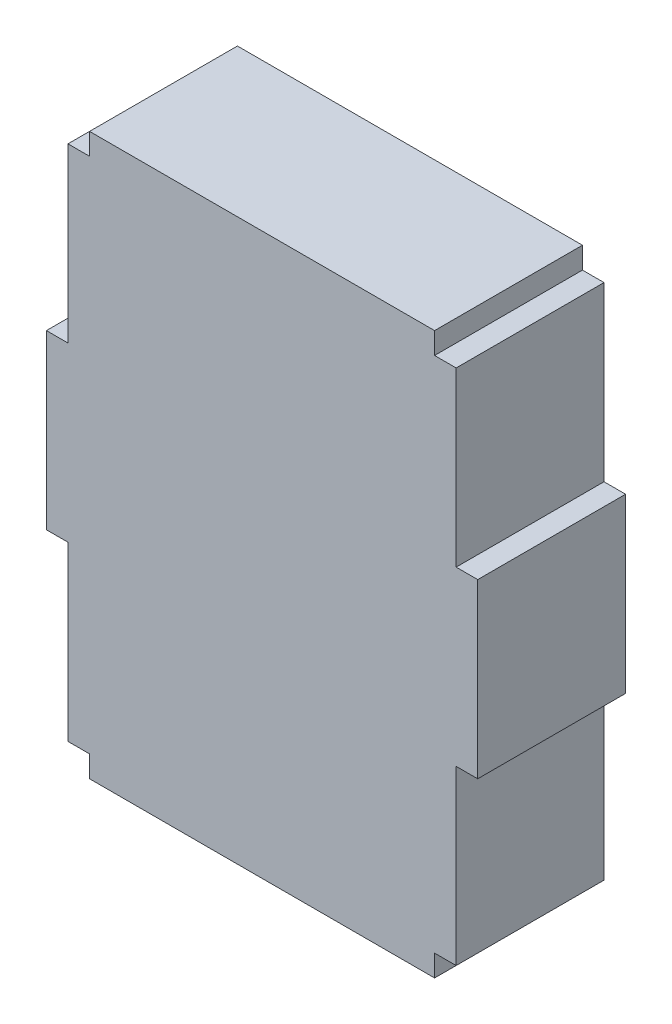
ISO-10303-21;
HEADER;
FILE_DESCRIPTION(('STEP AP214'),'2;1');
FILE_NAME('part.step','',(''),(''),'','','');
FILE_SCHEMA(('AUTOMOTIVE_DESIGN { 1 0 10303 214 1 1 1 1 }'));
ENDSEC;
DATA;
#1=APPLICATION_CONTEXT('core data for automotive mechanical design processes');
#2=APPLICATION_PROTOCOL_DEFINITION('international standard','automotive_design',2000,#1);
#3=PRODUCT_CONTEXT('',#1,'mechanical');
#4=PRODUCT('Part','Part','',(#3));
#5=PRODUCT_RELATED_PRODUCT_CATEGORY('part','',(#4));
#6=PRODUCT_DEFINITION_FORMATION('','',#4);
#7=PRODUCT_DEFINITION_CONTEXT('part definition',#1,'design');
#8=PRODUCT_DEFINITION('design','',#6,#7);
#9=PRODUCT_DEFINITION_SHAPE('','',#8);
#10=(LENGTH_UNIT() NAMED_UNIT(*) SI_UNIT(.MILLI.,.METRE.));
#11=(NAMED_UNIT(*) PLANE_ANGLE_UNIT() SI_UNIT($,.RADIAN.));
#12=(NAMED_UNIT(*) SI_UNIT($,.STERADIAN.) SOLID_ANGLE_UNIT());
#13=UNCERTAINTY_MEASURE_WITH_UNIT(LENGTH_MEASURE(1.E-05),#10,'distance_accuracy_value','');
#14=(GEOMETRIC_REPRESENTATION_CONTEXT(3) GLOBAL_UNCERTAINTY_ASSIGNED_CONTEXT((#13)) GLOBAL_UNIT_ASSIGNED_CONTEXT((#10,
#11,#12)) REPRESENTATION_CONTEXT('',''));
#15=CARTESIAN_POINT('',(0.,0.,0.));
#16=DIRECTION('',(0.,0.,1.));
#17=DIRECTION('',(1.,0.,0.));
#18=AXIS2_PLACEMENT_3D('',#15,#16,#17);
#19=CARTESIAN_POINT('',(3.9375,3.9375,3.));
#20=DIRECTION('',(0.,1.,0.));
#21=DIRECTION('',(0.,0.,1.));
#22=AXIS2_PLACEMENT_3D('',#19,#20,#21);
#23=PLANE('',#22);
#24=DIRECTION('',(1.,0.,0.));
#25=VECTOR('',#24,1.);
#26=CARTESIAN_POINT('',(3.9375,3.9375,0.));
#27=LINE('',#26,#25);
#28=CARTESIAN_POINT('',(3.9375,3.9375,0.));
#29=VERTEX_POINT('',#28);
#30=CARTESIAN_POINT('',(4.375,3.9375,0.));
#31=VERTEX_POINT('',#30);
#32=EDGE_CURVE('E201',#29,#31,#27,.T.);
#33=ORIENTED_EDGE('',*,*,#32,.T.);
#34=DIRECTION('',(0.,0.,-1.));
#35=VECTOR('',#34,1.);
#36=CARTESIAN_POINT('',(4.375,3.9375,3.));
#37=LINE('',#36,#35);
#38=CARTESIAN_POINT('',(4.375,3.9375,3.));
#39=VERTEX_POINT('',#38);
#40=EDGE_CURVE('E11',#39,#31,#37,.T.);
#41=ORIENTED_EDGE('',*,*,#40,.F.);
#42=DIRECTION('',(1.,0.,0.));
#43=VECTOR('',#42,1.);
#44=CARTESIAN_POINT('',(3.9375,3.9375,3.));
#45=LINE('',#44,#43);
#46=CARTESIAN_POINT('',(3.9375,3.9375,3.));
#47=VERTEX_POINT('',#46);
#48=EDGE_CURVE('E251',#47,#39,#45,.T.);
#49=ORIENTED_EDGE('',*,*,#48,.F.);
#50=DIRECTION('',(0.,0.,-1.));
#51=VECTOR('',#50,1.);
#52=CARTESIAN_POINT('',(3.9375,3.9375,3.));
#53=LINE('',#52,#51);
#54=EDGE_CURVE('E197',#47,#29,#53,.T.);
#55=ORIENTED_EDGE('',*,*,#54,.T.);
#56=EDGE_LOOP('',(#33,#41,#49,#55));
#57=FACE_BOUND('',#56,.T.);
#58=ADVANCED_FACE('F32',(#57),#23,.F.);
#59=CARTESIAN_POINT('',(4.375,3.9375,3.));
#60=DIRECTION('',(-1.,0.,0.));
#61=DIRECTION('',(0.,0.,1.));
#62=AXIS2_PLACEMENT_3D('',#59,#60,#61);
#63=PLANE('',#62);
#64=DIRECTION('',(0.,1.,0.));
#65=VECTOR('',#64,1.);
#66=CARTESIAN_POINT('',(4.375,3.9375,0.));
#67=LINE('',#66,#65);
#68=CARTESIAN_POINT('',(4.375,7.4375,0.));
#69=VERTEX_POINT('',#68);
#70=EDGE_CURVE('E204',#31,#69,#67,.T.);
#71=ORIENTED_EDGE('',*,*,#70,.T.);
#72=DIRECTION('',(0.,0.,-1.));
#73=VECTOR('',#72,1.);
#74=CARTESIAN_POINT('',(4.375,7.4375,3.));
#75=LINE('',#74,#73);
#76=CARTESIAN_POINT('',(4.375,7.4375,3.));
#77=VERTEX_POINT('',#76);
#78=EDGE_CURVE('E40',#77,#69,#75,.T.);
#79=ORIENTED_EDGE('',*,*,#78,.F.);
#80=DIRECTION('',(0.,1.,0.));
#81=VECTOR('',#80,1.);
#82=CARTESIAN_POINT('',(4.375,3.9375,3.));
#83=LINE('',#82,#81);
#84=EDGE_CURVE('E127',#39,#77,#83,.T.);
#85=ORIENTED_EDGE('',*,*,#84,.F.);
#86=ORIENTED_EDGE('',*,*,#40,.T.);
#87=EDGE_LOOP('',(#71,#79,#85,#86));
#88=FACE_BOUND('',#87,.T.);
#89=ADVANCED_FACE('F361',(#88),#63,.F.);
#90=CARTESIAN_POINT('',(4.375,7.4375,3.));
#91=DIRECTION('',(0.,-1.,0.));
#92=DIRECTION('',(0.,0.,-1.));
#93=AXIS2_PLACEMENT_3D('',#90,#91,#92);
#94=PLANE('',#93);
#95=DIRECTION('',(-1.,0.,0.));
#96=VECTOR('',#95,1.);
#97=CARTESIAN_POINT('',(4.375,7.4375,0.));
#98=LINE('',#97,#96);
#99=CARTESIAN_POINT('',(3.9375,7.4375,0.));
#100=VERTEX_POINT('',#99);
#101=EDGE_CURVE('E206',#69,#100,#98,.T.);
#102=ORIENTED_EDGE('',*,*,#101,.T.);
#103=DIRECTION('',(0.,0.,-1.));
#104=VECTOR('',#103,1.);
#105=CARTESIAN_POINT('',(3.9375,7.4375,3.));
#106=LINE('',#105,#104);
#107=CARTESIAN_POINT('',(3.9375,7.4375,3.));
#108=VERTEX_POINT('',#107);
#109=EDGE_CURVE('E282',#108,#100,#106,.T.);
#110=ORIENTED_EDGE('',*,*,#109,.F.);
#111=DIRECTION('',(-1.,0.,0.));
#112=VECTOR('',#111,1.);
#113=CARTESIAN_POINT('',(4.375,7.4375,3.));
#114=LINE('',#113,#112);
#115=EDGE_CURVE('E290',#77,#108,#114,.T.);
#116=ORIENTED_EDGE('',*,*,#115,.F.);
#117=ORIENTED_EDGE('',*,*,#78,.T.);
#118=EDGE_LOOP('',(#102,#110,#116,#117));
#119=FACE_BOUND('',#118,.T.);
#120=ADVANCED_FACE('F288',(#119),#94,.F.);
#121=CARTESIAN_POINT('',(3.9375,7.4375,3.));
#122=DIRECTION('',(-1.,0.,0.));
#123=DIRECTION('',(0.,0.,1.));
#124=AXIS2_PLACEMENT_3D('',#121,#122,#123);
#125=PLANE('',#124);
#126=DIRECTION('',(0.,1.,0.));
#127=VECTOR('',#126,1.);
#128=CARTESIAN_POINT('',(3.9375,7.4375,0.));
#129=LINE('',#128,#127);
#130=CARTESIAN_POINT('',(3.9375,10.9375,0.));
#131=VERTEX_POINT('',#130);
#132=EDGE_CURVE('E208',#100,#131,#129,.T.);
#133=ORIENTED_EDGE('',*,*,#132,.T.);
#134=DIRECTION('',(0.,0.,-1.));
#135=VECTOR('',#134,1.);
#136=CARTESIAN_POINT('',(3.9375,10.9375,3.));
#137=LINE('',#136,#135);
#138=CARTESIAN_POINT('',(3.9375,10.9375,3.));
#139=VERTEX_POINT('',#138);
#140=EDGE_CURVE('E280',#139,#131,#137,.T.);
#141=ORIENTED_EDGE('',*,*,#140,.F.);
#142=DIRECTION('',(0.,1.,0.));
#143=VECTOR('',#142,1.);
#144=CARTESIAN_POINT('',(3.9375,7.4375,3.));
#145=LINE('',#144,#143);
#146=EDGE_CURVE('E302',#108,#139,#145,.T.);
#147=ORIENTED_EDGE('',*,*,#146,.F.);
#148=ORIENTED_EDGE('',*,*,#109,.T.);
#149=EDGE_LOOP('',(#133,#141,#147,#148));
#150=FACE_BOUND('',#149,.T.);
#151=ADVANCED_FACE('F299',(#150),#125,.F.);
#152=CARTESIAN_POINT('',(3.5,10.9375,3.));
#153=DIRECTION('',(0.,1.,0.));
#154=DIRECTION('',(0.,0.,1.));
#155=AXIS2_PLACEMENT_3D('',#152,#153,#154);
#156=PLANE('',#155);
#157=DIRECTION('',(1.,0.,0.));
#158=VECTOR('',#157,1.);
#159=CARTESIAN_POINT('',(3.5,10.9375,0.));
#160=LINE('',#159,#158);
#161=CARTESIAN_POINT('',(3.5,10.9375,0.));
#162=VERTEX_POINT('',#161);
#163=EDGE_CURVE('E211',#162,#131,#160,.T.);
#164=ORIENTED_EDGE('',*,*,#163,.F.);
#165=DIRECTION('',(0.,0.,-1.));
#166=VECTOR('',#165,1.);
#167=CARTESIAN_POINT('',(3.5,10.9375,3.));
#168=LINE('',#167,#166);
#169=CARTESIAN_POINT('',(3.5,10.9375,3.));
#170=VERTEX_POINT('',#169);
#171=EDGE_CURVE('E278',#170,#162,#168,.T.);
#172=ORIENTED_EDGE('',*,*,#171,.F.);
#173=DIRECTION('',(1.,0.,0.));
#174=VECTOR('',#173,1.);
#175=CARTESIAN_POINT('',(3.5,10.9375,3.));
#176=LINE('',#175,#174);
#177=EDGE_CURVE('E304',#170,#139,#176,.T.);
#178=ORIENTED_EDGE('',*,*,#177,.T.);
#179=ORIENTED_EDGE('',*,*,#140,.T.);
#180=EDGE_LOOP('',(#164,#172,#178,#179));
#181=FACE_BOUND('',#180,.T.);
#182=ADVANCED_FACE('F509',(#181),#156,.T.);
#183=CARTESIAN_POINT('',(3.5,10.9375,3.));
#184=DIRECTION('',(-1.,0.,0.));
#185=DIRECTION('',(0.,0.,1.));
#186=AXIS2_PLACEMENT_3D('',#183,#184,#185);
#187=PLANE('',#186);
#188=DIRECTION('',(0.,1.,0.));
#189=VECTOR('',#188,1.);
#190=CARTESIAN_POINT('',(3.5,10.9375,0.));
#191=LINE('',#190,#189);
#192=CARTESIAN_POINT('',(3.5,11.375,0.));
#193=VERTEX_POINT('',#192);
#194=EDGE_CURVE('E214',#162,#193,#191,.T.);
#195=ORIENTED_EDGE('',*,*,#194,.T.);
#196=DIRECTION('',(0.,0.,-1.));
#197=VECTOR('',#196,1.);
#198=CARTESIAN_POINT('',(3.5,11.375,3.));
#199=LINE('',#198,#197);
#200=CARTESIAN_POINT('',(3.5,11.375,3.));
#201=VERTEX_POINT('',#200);
#202=EDGE_CURVE('E275',#201,#193,#199,.T.);
#203=ORIENTED_EDGE('',*,*,#202,.F.);
#204=DIRECTION('',(0.,1.,0.));
#205=VECTOR('',#204,1.);
#206=CARTESIAN_POINT('',(3.5,10.9375,3.));
#207=LINE('',#206,#205);
#208=EDGE_CURVE('E306',#170,#201,#207,.T.);
#209=ORIENTED_EDGE('',*,*,#208,.F.);
#210=ORIENTED_EDGE('',*,*,#171,.T.);
#211=EDGE_LOOP('',(#195,#203,#209,#210));
#212=FACE_BOUND('',#211,.T.);
#213=ADVANCED_FACE('F499',(#212),#187,.F.);
#214=CARTESIAN_POINT('',(3.5,11.375,3.));
#215=DIRECTION('',(0.,-1.,0.));
#216=DIRECTION('',(0.,0.,-1.));
#217=AXIS2_PLACEMENT_3D('',#214,#215,#216);
#218=PLANE('',#217);
#219=DIRECTION('',(-1.,0.,0.));
#220=VECTOR('',#219,1.);
#221=CARTESIAN_POINT('',(3.5,11.375,0.));
#222=LINE('',#221,#220);
#223=CARTESIAN_POINT('',(-3.5,11.375,0.));
#224=VERTEX_POINT('',#223);
#225=EDGE_CURVE('E216',#193,#224,#222,.T.);
#226=ORIENTED_EDGE('',*,*,#225,.T.);
#227=DIRECTION('',(0.,0.,-1.));
#228=VECTOR('',#227,1.);
#229=CARTESIAN_POINT('',(-3.5,11.375,3.));
#230=LINE('',#229,#228);
#231=CARTESIAN_POINT('',(-3.5,11.375,3.));
#232=VERTEX_POINT('',#231);
#233=EDGE_CURVE('E273',#232,#224,#230,.T.);
#234=ORIENTED_EDGE('',*,*,#233,.F.);
#235=DIRECTION('',(-1.,0.,0.));
#236=VECTOR('',#235,1.);
#237=CARTESIAN_POINT('',(3.5,11.375,3.));
#238=LINE('',#237,#236);
#239=EDGE_CURVE('E312',#201,#232,#238,.T.);
#240=ORIENTED_EDGE('',*,*,#239,.F.);
#241=ORIENTED_EDGE('',*,*,#202,.T.);
#242=EDGE_LOOP('',(#226,#234,#240,#241));
#243=FACE_BOUND('',#242,.T.);
#244=ADVANCED_FACE('F489',(#243),#218,.F.);
#245=CARTESIAN_POINT('',(-3.5,10.9375,3.));
#246=DIRECTION('',(-1.,0.,0.));
#247=DIRECTION('',(0.,0.,1.));
#248=AXIS2_PLACEMENT_3D('',#245,#246,#247);
#249=PLANE('',#248);
#250=DIRECTION('',(0.,1.,0.));
#251=VECTOR('',#250,1.);
#252=CARTESIAN_POINT('',(-3.5,10.9375,0.));
#253=LINE('',#252,#251);
#254=CARTESIAN_POINT('',(-3.5,10.9375,0.));
#255=VERTEX_POINT('',#254);
#256=EDGE_CURVE('E219',#255,#224,#253,.T.);
#257=ORIENTED_EDGE('',*,*,#256,.F.);
#258=DIRECTION('',(0.,0.,-1.));
#259=VECTOR('',#258,1.);
#260=CARTESIAN_POINT('',(-3.5,10.9375,3.));
#261=LINE('',#260,#259);
#262=CARTESIAN_POINT('',(-3.5,10.9375,3.));
#263=VERTEX_POINT('',#262);
#264=EDGE_CURVE('E271',#263,#255,#261,.T.);
#265=ORIENTED_EDGE('',*,*,#264,.F.);
#266=DIRECTION('',(0.,1.,0.));
#267=VECTOR('',#266,1.);
#268=CARTESIAN_POINT('',(-3.5,10.9375,3.));
#269=LINE('',#268,#267);
#270=EDGE_CURVE('E314',#263,#232,#269,.T.);
#271=ORIENTED_EDGE('',*,*,#270,.T.);
#272=ORIENTED_EDGE('',*,*,#233,.T.);
#273=EDGE_LOOP('',(#257,#265,#271,#272));
#274=FACE_BOUND('',#273,.T.);
#275=ADVANCED_FACE('F479',(#274),#249,.T.);
#276=CARTESIAN_POINT('',(-3.5,10.9375,3.));
#277=DIRECTION('',(0.,-1.,0.));
#278=DIRECTION('',(0.,0.,-1.));
#279=AXIS2_PLACEMENT_3D('',#276,#277,#278);
#280=PLANE('',#279);
#281=DIRECTION('',(-1.,0.,0.));
#282=VECTOR('',#281,1.);
#283=CARTESIAN_POINT('',(-3.5,10.9375,0.));
#284=LINE('',#283,#282);
#285=CARTESIAN_POINT('',(-3.9375,10.9375,0.));
#286=VERTEX_POINT('',#285);
#287=EDGE_CURVE('E222',#255,#286,#284,.T.);
#288=ORIENTED_EDGE('',*,*,#287,.T.);
#289=DIRECTION('',(0.,0.,-1.));
#290=VECTOR('',#289,1.);
#291=CARTESIAN_POINT('',(-3.9375,10.9375,3.));
#292=LINE('',#291,#290);
#293=CARTESIAN_POINT('',(-3.9375,10.9375,3.));
#294=VERTEX_POINT('',#293);
#295=EDGE_CURVE('E269',#294,#286,#292,.T.);
#296=ORIENTED_EDGE('',*,*,#295,.F.);
#297=DIRECTION('',(-1.,0.,0.));
#298=VECTOR('',#297,1.);
#299=CARTESIAN_POINT('',(-3.5,10.9375,3.));
#300=LINE('',#299,#298);
#301=EDGE_CURVE('E317',#263,#294,#300,.T.);
#302=ORIENTED_EDGE('',*,*,#301,.F.);
#303=ORIENTED_EDGE('',*,*,#264,.T.);
#304=EDGE_LOOP('',(#288,#296,#302,#303));
#305=FACE_BOUND('',#304,.T.);
#306=ADVANCED_FACE('F469',(#305),#280,.F.);
#307=CARTESIAN_POINT('',(-3.9375,7.4375,3.));
#308=DIRECTION('',(-1.,0.,0.));
#309=DIRECTION('',(0.,0.,1.));
#310=AXIS2_PLACEMENT_3D('',#307,#308,#309);
#311=PLANE('',#310);
#312=DIRECTION('',(0.,1.,0.));
#313=VECTOR('',#312,1.);
#314=CARTESIAN_POINT('',(-3.9375,7.4375,0.));
#315=LINE('',#314,#313);
#316=CARTESIAN_POINT('',(-3.9375,7.4375,0.));
#317=VERTEX_POINT('',#316);
#318=EDGE_CURVE('E225',#317,#286,#315,.T.);
#319=ORIENTED_EDGE('',*,*,#318,.F.);
#320=DIRECTION('',(0.,0.,-1.));
#321=VECTOR('',#320,1.);
#322=CARTESIAN_POINT('',(-3.9375,7.4375,3.));
#323=LINE('',#322,#321);
#324=CARTESIAN_POINT('',(-3.9375,7.4375,3.));
#325=VERTEX_POINT('',#324);
#326=EDGE_CURVE('E267',#325,#317,#323,.T.);
#327=ORIENTED_EDGE('',*,*,#326,.F.);
#328=DIRECTION('',(0.,1.,0.));
#329=VECTOR('',#328,1.);
#330=CARTESIAN_POINT('',(-3.9375,7.4375,3.));
#331=LINE('',#330,#329);
#332=EDGE_CURVE('E319',#325,#294,#331,.T.);
#333=ORIENTED_EDGE('',*,*,#332,.T.);
#334=ORIENTED_EDGE('',*,*,#295,.T.);
#335=EDGE_LOOP('',(#319,#327,#333,#334));
#336=FACE_BOUND('',#335,.T.);
#337=ADVANCED_FACE('F459',(#336),#311,.T.);
#338=CARTESIAN_POINT('',(-4.375,7.4375,3.));
#339=DIRECTION('',(0.,1.,0.));
#340=DIRECTION('',(0.,0.,1.));
#341=AXIS2_PLACEMENT_3D('',#338,#339,#340);
#342=PLANE('',#341);
#343=DIRECTION('',(1.,0.,0.));
#344=VECTOR('',#343,1.);
#345=CARTESIAN_POINT('',(-4.375,7.4375,0.));
#346=LINE('',#345,#344);
#347=CARTESIAN_POINT('',(-4.375,7.4375,0.));
#348=VERTEX_POINT('',#347);
#349=EDGE_CURVE('E228',#348,#317,#346,.T.);
#350=ORIENTED_EDGE('',*,*,#349,.F.);
#351=DIRECTION('',(0.,0.,-1.));
#352=VECTOR('',#351,1.);
#353=CARTESIAN_POINT('',(-4.375,7.4375,3.));
#354=LINE('',#353,#352);
#355=CARTESIAN_POINT('',(-4.375,7.4375,3.));
#356=VERTEX_POINT('',#355);
#357=EDGE_CURVE('E265',#356,#348,#354,.T.);
#358=ORIENTED_EDGE('',*,*,#357,.F.);
#359=DIRECTION('',(1.,0.,0.));
#360=VECTOR('',#359,1.);
#361=CARTESIAN_POINT('',(-4.375,7.4375,3.));
#362=LINE('',#361,#360);
#363=EDGE_CURVE('E322',#356,#325,#362,.T.);
#364=ORIENTED_EDGE('',*,*,#363,.T.);
#365=ORIENTED_EDGE('',*,*,#326,.T.);
#366=EDGE_LOOP('',(#350,#358,#364,#365));
#367=FACE_BOUND('',#366,.T.);
#368=ADVANCED_FACE('F449',(#367),#342,.T.);
#369=CARTESIAN_POINT('',(-4.375,3.9375,3.));
#370=DIRECTION('',(-1.,0.,0.));
#371=DIRECTION('',(0.,0.,1.));
#372=AXIS2_PLACEMENT_3D('',#369,#370,#371);
#373=PLANE('',#372);
#374=DIRECTION('',(0.,1.,0.));
#375=VECTOR('',#374,1.);
#376=CARTESIAN_POINT('',(-4.375,3.9375,0.));
#377=LINE('',#376,#375);
#378=CARTESIAN_POINT('',(-4.375,3.9375,0.));
#379=VERTEX_POINT('',#378);
#380=EDGE_CURVE('E231',#379,#348,#377,.T.);
#381=ORIENTED_EDGE('',*,*,#380,.F.);
#382=DIRECTION('',(0.,0.,-1.));
#383=VECTOR('',#382,1.);
#384=CARTESIAN_POINT('',(-4.375,3.9375,3.));
#385=LINE('',#384,#383);
#386=CARTESIAN_POINT('',(-4.375,3.9375,3.));
#387=VERTEX_POINT('',#386);
#388=EDGE_CURVE('E263',#387,#379,#385,.T.);
#389=ORIENTED_EDGE('',*,*,#388,.F.);
#390=DIRECTION('',(0.,1.,0.));
#391=VECTOR('',#390,1.);
#392=CARTESIAN_POINT('',(-4.375,3.9375,3.));
#393=LINE('',#392,#391);
#394=EDGE_CURVE('E325',#387,#356,#393,.T.);
#395=ORIENTED_EDGE('',*,*,#394,.T.);
#396=ORIENTED_EDGE('',*,*,#357,.T.);
#397=EDGE_LOOP('',(#381,#389,#395,#396));
#398=FACE_BOUND('',#397,.T.);
#399=ADVANCED_FACE('F439',(#398),#373,.T.);
#400=CARTESIAN_POINT('',(-3.9375,3.9375,3.));
#401=DIRECTION('',(0.,-1.,0.));
#402=DIRECTION('',(0.,0.,-1.));
#403=AXIS2_PLACEMENT_3D('',#400,#401,#402);
#404=PLANE('',#403);
#405=DIRECTION('',(-1.,0.,0.));
#406=VECTOR('',#405,1.);
#407=CARTESIAN_POINT('',(-3.9375,3.9375,0.));
#408=LINE('',#407,#406);
#409=CARTESIAN_POINT('',(-3.9375,3.9375,0.));
#410=VERTEX_POINT('',#409);
#411=EDGE_CURVE('E234',#410,#379,#408,.T.);
#412=ORIENTED_EDGE('',*,*,#411,.F.);
#413=DIRECTION('',(0.,0.,-1.));
#414=VECTOR('',#413,1.);
#415=CARTESIAN_POINT('',(-3.9375,3.9375,3.));
#416=LINE('',#415,#414);
#417=CARTESIAN_POINT('',(-3.9375,3.9375,3.));
#418=VERTEX_POINT('',#417);
#419=EDGE_CURVE('E261',#418,#410,#416,.T.);
#420=ORIENTED_EDGE('',*,*,#419,.F.);
#421=DIRECTION('',(-1.,0.,0.));
#422=VECTOR('',#421,1.);
#423=CARTESIAN_POINT('',(-3.9375,3.9375,3.));
#424=LINE('',#423,#422);
#425=EDGE_CURVE('E328',#418,#387,#424,.T.);
#426=ORIENTED_EDGE('',*,*,#425,.T.);
#427=ORIENTED_EDGE('',*,*,#388,.T.);
#428=EDGE_LOOP('',(#412,#420,#426,#427));
#429=FACE_BOUND('',#428,.T.);
#430=ADVANCED_FACE('F429',(#429),#404,.T.);
#431=CARTESIAN_POINT('',(-3.9375,0.4375,3.));
#432=DIRECTION('',(-1.,0.,0.));
#433=DIRECTION('',(0.,0.,1.));
#434=AXIS2_PLACEMENT_3D('',#431,#432,#433);
#435=PLANE('',#434);
#436=DIRECTION('',(0.,1.,0.));
#437=VECTOR('',#436,1.);
#438=CARTESIAN_POINT('',(-3.9375,0.4375,0.));
#439=LINE('',#438,#437);
#440=CARTESIAN_POINT('',(-3.9375,0.4375,0.));
#441=VERTEX_POINT('',#440);
#442=EDGE_CURVE('E237',#441,#410,#439,.T.);
#443=ORIENTED_EDGE('',*,*,#442,.F.);
#444=DIRECTION('',(0.,0.,-1.));
#445=VECTOR('',#444,1.);
#446=CARTESIAN_POINT('',(-3.9375,0.4375,3.));
#447=LINE('',#446,#445);
#448=CARTESIAN_POINT('',(-3.9375,0.4375,3.));
#449=VERTEX_POINT('',#448);
#450=EDGE_CURVE('E259',#449,#441,#447,.T.);
#451=ORIENTED_EDGE('',*,*,#450,.F.);
#452=DIRECTION('',(0.,1.,0.));
#453=VECTOR('',#452,1.);
#454=CARTESIAN_POINT('',(-3.9375,0.4375,3.));
#455=LINE('',#454,#453);
#456=EDGE_CURVE('E331',#449,#418,#455,.T.);
#457=ORIENTED_EDGE('',*,*,#456,.T.);
#458=ORIENTED_EDGE('',*,*,#419,.T.);
#459=EDGE_LOOP('',(#443,#451,#457,#458));
#460=FACE_BOUND('',#459,.T.);
#461=ADVANCED_FACE('F420',(#460),#435,.T.);
#462=CARTESIAN_POINT('',(-3.5,0.4375,3.));
#463=DIRECTION('',(0.,-1.,0.));
#464=DIRECTION('',(0.,0.,-1.));
#465=AXIS2_PLACEMENT_3D('',#462,#463,#464);
#466=PLANE('',#465);
#467=DIRECTION('',(-1.,0.,0.));
#468=VECTOR('',#467,1.);
#469=CARTESIAN_POINT('',(-3.5,0.4375,0.));
#470=LINE('',#469,#468);
#471=CARTESIAN_POINT('',(-3.5,0.4375,0.));
#472=VERTEX_POINT('',#471);
#473=EDGE_CURVE('E240',#472,#441,#470,.T.);
#474=ORIENTED_EDGE('',*,*,#473,.F.);
#475=DIRECTION('',(0.,0.,-1.));
#476=VECTOR('',#475,1.);
#477=CARTESIAN_POINT('',(-3.5,0.4375,3.));
#478=LINE('',#477,#476);
#479=CARTESIAN_POINT('',(-3.5,0.4375,3.));
#480=VERTEX_POINT('',#479);
#481=EDGE_CURVE('E257',#480,#472,#478,.T.);
#482=ORIENTED_EDGE('',*,*,#481,.F.);
#483=DIRECTION('',(-1.,0.,0.));
#484=VECTOR('',#483,1.);
#485=CARTESIAN_POINT('',(-3.5,0.4375,3.));
#486=LINE('',#485,#484);
#487=EDGE_CURVE('E334',#480,#449,#486,.T.);
#488=ORIENTED_EDGE('',*,*,#487,.T.);
#489=ORIENTED_EDGE('',*,*,#450,.T.);
#490=EDGE_LOOP('',(#474,#482,#488,#489));
#491=FACE_BOUND('',#490,.T.);
#492=ADVANCED_FACE('F347',(#491),#466,.T.);
#493=CARTESIAN_POINT('',(-3.5,0.,3.));
#494=DIRECTION('',(-1.,0.,0.));
#495=DIRECTION('',(0.,0.,1.));
#496=AXIS2_PLACEMENT_3D('',#493,#494,#495);
#497=PLANE('',#496);
#498=DIRECTION('',(0.,1.,0.));
#499=VECTOR('',#498,1.);
#500=CARTESIAN_POINT('',(-3.5,0.,0.));
#501=LINE('',#500,#499);
#502=CARTESIAN_POINT('',(-3.5,0.,0.));
#503=VERTEX_POINT('',#502);
#504=EDGE_CURVE('E243',#503,#472,#501,.T.);
#505=ORIENTED_EDGE('',*,*,#504,.F.);
#506=DIRECTION('',(0.,0.,-1.));
#507=VECTOR('',#506,1.);
#508=CARTESIAN_POINT('',(-3.5,0.,3.));
#509=LINE('',#508,#507);
#510=CARTESIAN_POINT('',(-3.5,0.,3.));
#511=VERTEX_POINT('',#510);
#512=EDGE_CURVE('E255',#511,#503,#509,.T.);
#513=ORIENTED_EDGE('',*,*,#512,.F.);
#514=DIRECTION('',(0.,1.,0.));
#515=VECTOR('',#514,1.);
#516=CARTESIAN_POINT('',(-3.5,0.,3.));
#517=LINE('',#516,#515);
#518=EDGE_CURVE('E337',#511,#480,#517,.T.);
#519=ORIENTED_EDGE('',*,*,#518,.T.);
#520=ORIENTED_EDGE('',*,*,#481,.T.);
#521=EDGE_LOOP('',(#505,#513,#519,#520));
#522=FACE_BOUND('',#521,.T.);
#523=ADVANCED_FACE('F341',(#522),#497,.T.);
#524=CARTESIAN_POINT('',(-3.5,0.,3.));
#525=DIRECTION('',(0.,1.,0.));
#526=DIRECTION('',(0.,0.,1.));
#527=AXIS2_PLACEMENT_3D('',#524,#525,#526);
#528=PLANE('',#527);
#529=DIRECTION('',(1.,0.,0.));
#530=VECTOR('',#529,1.);
#531=CARTESIAN_POINT('',(-3.5,0.,0.));
#532=LINE('',#531,#530);
#533=CARTESIAN_POINT('',(3.5,0.,0.));
#534=VERTEX_POINT('',#533);
#535=EDGE_CURVE('E246',#503,#534,#532,.T.);
#536=ORIENTED_EDGE('',*,*,#535,.T.);
#537=DIRECTION('',(0.,0.,-1.));
#538=VECTOR('',#537,1.);
#539=CARTESIAN_POINT('',(3.5,0.,3.));
#540=LINE('',#539,#538);
#541=CARTESIAN_POINT('',(3.5,0.,3.));
#542=VERTEX_POINT('',#541);
#543=EDGE_CURVE('E192',#542,#534,#540,.T.);
#544=ORIENTED_EDGE('',*,*,#543,.F.);
#545=DIRECTION('',(1.,0.,0.));
#546=VECTOR('',#545,1.);
#547=CARTESIAN_POINT('',(-3.5,0.,3.));
#548=LINE('',#547,#546);
#549=EDGE_CURVE('E183',#511,#542,#548,.T.);
#550=ORIENTED_EDGE('',*,*,#549,.F.);
#551=ORIENTED_EDGE('',*,*,#512,.T.);
#552=EDGE_LOOP('',(#536,#544,#550,#551));
#553=FACE_BOUND('',#552,.T.);
#554=ADVANCED_FACE('F351',(#553),#528,.F.);
#555=CARTESIAN_POINT('',(3.5,0.,3.));
#556=DIRECTION('',(-1.,0.,0.));
#557=DIRECTION('',(0.,0.,1.));
#558=AXIS2_PLACEMENT_3D('',#555,#556,#557);
#559=PLANE('',#558);
#560=DIRECTION('',(0.,1.,0.));
#561=VECTOR('',#560,1.);
#562=CARTESIAN_POINT('',(3.5,0.,0.));
#563=LINE('',#562,#561);
#564=CARTESIAN_POINT('',(3.5,0.4375,0.));
#565=VERTEX_POINT('',#564);
#566=EDGE_CURVE('E191',#534,#565,#563,.T.);
#567=ORIENTED_EDGE('',*,*,#566,.T.);
#568=DIRECTION('',(0.,0.,-1.));
#569=VECTOR('',#568,1.);
#570=CARTESIAN_POINT('',(3.5,0.4375,3.));
#571=LINE('',#570,#569);
#572=CARTESIAN_POINT('',(3.5,0.4375,3.));
#573=VERTEX_POINT('',#572);
#574=EDGE_CURVE('E188',#573,#565,#571,.T.);
#575=ORIENTED_EDGE('',*,*,#574,.F.);
#576=DIRECTION('',(0.,1.,0.));
#577=VECTOR('',#576,1.);
#578=CARTESIAN_POINT('',(3.5,0.,3.));
#579=LINE('',#578,#577);
#580=EDGE_CURVE('E176',#542,#573,#579,.T.);
#581=ORIENTED_EDGE('',*,*,#580,.F.);
#582=ORIENTED_EDGE('',*,*,#543,.T.);
#583=EDGE_LOOP('',(#567,#575,#581,#582));
#584=FACE_BOUND('',#583,.T.);
#585=ADVANCED_FACE('F189',(#584),#559,.F.);
#586=CARTESIAN_POINT('',(3.5,0.4375,3.));
#587=DIRECTION('',(0.,1.,0.));
#588=DIRECTION('',(0.,0.,1.));
#589=AXIS2_PLACEMENT_3D('',#586,#587,#588);
#590=PLANE('',#589);
#591=DIRECTION('',(1.,0.,0.));
#592=VECTOR('',#591,1.);
#593=CARTESIAN_POINT('',(3.5,0.4375,0.));
#594=LINE('',#593,#592);
#595=CARTESIAN_POINT('',(3.9375,0.4375,0.));
#596=VERTEX_POINT('',#595);
#597=EDGE_CURVE('E113',#565,#596,#594,.T.);
#598=ORIENTED_EDGE('',*,*,#597,.T.);
#599=DIRECTION('',(0.,0.,-1.));
#600=VECTOR('',#599,1.);
#601=CARTESIAN_POINT('',(3.9375,0.4375,3.));
#602=LINE('',#601,#600);
#603=CARTESIAN_POINT('',(3.9375,0.4375,3.));
#604=VERTEX_POINT('',#603);
#605=EDGE_CURVE('E193',#604,#596,#602,.T.);
#606=ORIENTED_EDGE('',*,*,#605,.F.);
#607=DIRECTION('',(1.,0.,0.));
#608=VECTOR('',#607,1.);
#609=CARTESIAN_POINT('',(3.5,0.4375,3.));
#610=LINE('',#609,#608);
#611=EDGE_CURVE('E180',#573,#604,#610,.T.);
#612=ORIENTED_EDGE('',*,*,#611,.F.);
#613=ORIENTED_EDGE('',*,*,#574,.T.);
#614=EDGE_LOOP('',(#598,#606,#612,#613));
#615=FACE_BOUND('',#614,.T.);
#616=ADVANCED_FACE('F195',(#615),#590,.F.);
#617=CARTESIAN_POINT('',(3.9375,0.4375,3.));
#618=DIRECTION('',(-1.,0.,0.));
#619=DIRECTION('',(0.,0.,1.));
#620=AXIS2_PLACEMENT_3D('',#617,#618,#619);
#621=PLANE('',#620);
#622=DIRECTION('',(0.,1.,0.));
#623=VECTOR('',#622,1.);
#624=CARTESIAN_POINT('',(3.9375,0.4375,0.));
#625=LINE('',#624,#623);
#626=EDGE_CURVE('E119',#596,#29,#625,.T.);
#627=ORIENTED_EDGE('',*,*,#626,.T.);
#628=ORIENTED_EDGE('',*,*,#54,.F.);
#629=DIRECTION('',(0.,1.,0.));
#630=VECTOR('',#629,1.);
#631=CARTESIAN_POINT('',(3.9375,0.4375,3.));
#632=LINE('',#631,#630);
#633=EDGE_CURVE('E48',#604,#47,#632,.T.);
#634=ORIENTED_EDGE('',*,*,#633,.F.);
#635=ORIENTED_EDGE('',*,*,#605,.T.);
#636=EDGE_LOOP('',(#627,#628,#634,#635));
#637=FACE_BOUND('',#636,.T.);
#638=ADVANCED_FACE('F368',(#637),#621,.F.);
#639=CARTESIAN_POINT('',(0.,0.,3.));
#640=DIRECTION('',(0.,0.,1.));
#641=DIRECTION('',(1.,0.,0.));
#642=AXIS2_PLACEMENT_3D('',#639,#640,#641);
#643=PLANE('',#642);
#644=ORIENTED_EDGE('',*,*,#48,.T.);
#645=ORIENTED_EDGE('',*,*,#84,.T.);
#646=ORIENTED_EDGE('',*,*,#115,.T.);
#647=ORIENTED_EDGE('',*,*,#146,.T.);
#648=ORIENTED_EDGE('',*,*,#177,.F.);
#649=ORIENTED_EDGE('',*,*,#208,.T.);
#650=ORIENTED_EDGE('',*,*,#239,.T.);
#651=ORIENTED_EDGE('',*,*,#270,.F.);
#652=ORIENTED_EDGE('',*,*,#301,.T.);
#653=ORIENTED_EDGE('',*,*,#332,.F.);
#654=ORIENTED_EDGE('',*,*,#363,.F.);
#655=ORIENTED_EDGE('',*,*,#394,.F.);
#656=ORIENTED_EDGE('',*,*,#425,.F.);
#657=ORIENTED_EDGE('',*,*,#456,.F.);
#658=ORIENTED_EDGE('',*,*,#487,.F.);
#659=ORIENTED_EDGE('',*,*,#518,.F.);
#660=ORIENTED_EDGE('',*,*,#549,.T.);
#661=ORIENTED_EDGE('',*,*,#580,.T.);
#662=ORIENTED_EDGE('',*,*,#611,.T.);
#663=ORIENTED_EDGE('',*,*,#633,.T.);
#664=EDGE_LOOP('',(#644,#645,#646,#647,#648,#649,#650,#651,#652,#653,#654,#655,#656,#657,#658,
#659,#660,#661,#662,#663));
#665=FACE_BOUND('',#664,.T.);
#666=ADVANCED_FACE('F178',(#665),#643,.T.);
#667=CARTESIAN_POINT('',(0.,0.,0.));
#668=DIRECTION('',(0.,0.,1.));
#669=DIRECTION('',(1.,0.,0.));
#670=AXIS2_PLACEMENT_3D('',#667,#668,#669);
#671=PLANE('',#670);
#672=ORIENTED_EDGE('',*,*,#32,.F.);
#673=ORIENTED_EDGE('',*,*,#626,.F.);
#674=ORIENTED_EDGE('',*,*,#597,.F.);
#675=ORIENTED_EDGE('',*,*,#566,.F.);
#676=ORIENTED_EDGE('',*,*,#535,.F.);
#677=ORIENTED_EDGE('',*,*,#504,.T.);
#678=ORIENTED_EDGE('',*,*,#473,.T.);
#679=ORIENTED_EDGE('',*,*,#442,.T.);
#680=ORIENTED_EDGE('',*,*,#411,.T.);
#681=ORIENTED_EDGE('',*,*,#380,.T.);
#682=ORIENTED_EDGE('',*,*,#349,.T.);
#683=ORIENTED_EDGE('',*,*,#318,.T.);
#684=ORIENTED_EDGE('',*,*,#287,.F.);
#685=ORIENTED_EDGE('',*,*,#256,.T.);
#686=ORIENTED_EDGE('',*,*,#225,.F.);
#687=ORIENTED_EDGE('',*,*,#194,.F.);
#688=ORIENTED_EDGE('',*,*,#163,.T.);
#689=ORIENTED_EDGE('',*,*,#132,.F.);
#690=ORIENTED_EDGE('',*,*,#101,.F.);
#691=ORIENTED_EDGE('',*,*,#70,.F.);
#692=EDGE_LOOP('',(#672,#673,#674,#675,#676,#677,#678,#679,#680,#681,#682,#683,#684,#685,#686,
#687,#688,#689,#690,#691));
#693=FACE_BOUND('',#692,.T.);
#694=ADVANCED_FACE('F294',(#693),#671,.F.);
#695=CLOSED_SHELL('',(#58,#89,#120,#151,#182,#213,#244,#275,#306,#337,#368,#399,#430,#461,#492,
#523,#554,#585,#616,#638,#666,#694));
#696=MANIFOLD_SOLID_BREP('B2',#695);
#697=ADVANCED_BREP_SHAPE_REPRESENTATION('',(#18,#696),#14);
#698=SHAPE_DEFINITION_REPRESENTATION(#9,#697);
ENDSEC;
END-ISO-10303-21;
